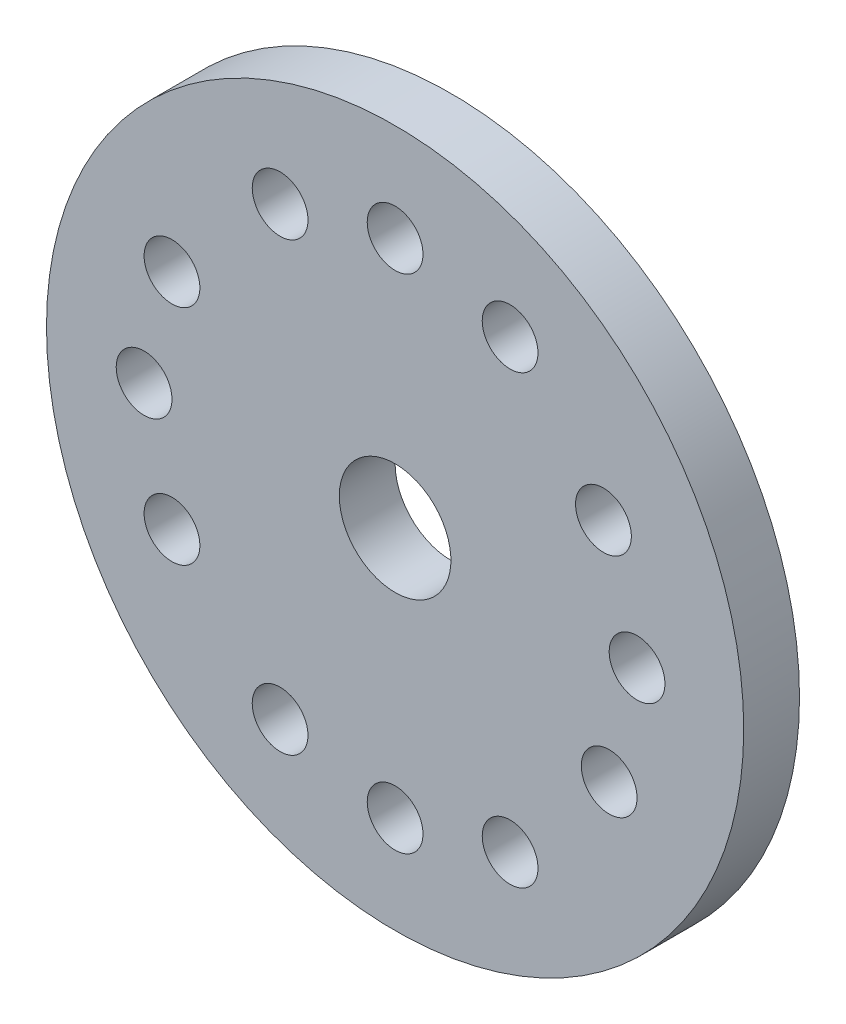
ISO-10303-21;
HEADER;
FILE_DESCRIPTION(('STEP AP214'),'2;1');
FILE_NAME('part.step','',(''),(''),'','','');
FILE_SCHEMA(('AUTOMOTIVE_DESIGN { 1 0 10303 214 1 1 1 1 }'));
ENDSEC;
DATA;
#1=APPLICATION_CONTEXT('core data for automotive mechanical design processes');
#2=APPLICATION_PROTOCOL_DEFINITION('international standard','automotive_design',2000,#1);
#3=PRODUCT_CONTEXT('',#1,'mechanical');
#4=PRODUCT('Part','Part','',(#3));
#5=PRODUCT_RELATED_PRODUCT_CATEGORY('part','',(#4));
#6=PRODUCT_DEFINITION_FORMATION('','',#4);
#7=PRODUCT_DEFINITION_CONTEXT('part definition',#1,'design');
#8=PRODUCT_DEFINITION('design','',#6,#7);
#9=PRODUCT_DEFINITION_SHAPE('','',#8);
#10=(LENGTH_UNIT() NAMED_UNIT(*) SI_UNIT(.MILLI.,.METRE.));
#11=(NAMED_UNIT(*) PLANE_ANGLE_UNIT() SI_UNIT($,.RADIAN.));
#12=(NAMED_UNIT(*) SI_UNIT($,.STERADIAN.) SOLID_ANGLE_UNIT());
#13=UNCERTAINTY_MEASURE_WITH_UNIT(LENGTH_MEASURE(1.E-05),#10,'distance_accuracy_value','');
#14=(GEOMETRIC_REPRESENTATION_CONTEXT(3) GLOBAL_UNCERTAINTY_ASSIGNED_CONTEXT((#13)) GLOBAL_UNIT_ASSIGNED_CONTEXT((#10,
#11,#12)) REPRESENTATION_CONTEXT('',''));
#15=CARTESIAN_POINT('',(0.,0.,0.));
#16=DIRECTION('',(0.,0.,1.));
#17=DIRECTION('',(1.,0.,0.));
#18=AXIS2_PLACEMENT_3D('',#15,#16,#17);
#19=CARTESIAN_POINT('',(0.,0.,0.));
#20=DIRECTION('',(0.,0.,-1.));
#21=DIRECTION('',(-1.,0.,0.));
#22=AXIS2_PLACEMENT_3D('',#19,#20,#21);
#23=PLANE('',#22);
#24=CARTESIAN_POINT('',(0.,0.,0.));
#25=DIRECTION('',(0.,0.,-1.));
#26=DIRECTION('',(-1.,0.,0.));
#27=AXIS2_PLACEMENT_3D('',#24,#25,#26);
#28=CIRCLE('',#27,2.);
#29=CARTESIAN_POINT('',(-2.,0.,0.));
#30=VERTEX_POINT('',#29);
#31=EDGE_CURVE('E65',#30,#30,#28,.F.);
#32=ORIENTED_EDGE('',*,*,#31,.T.);
#33=EDGE_LOOP('',(#32));
#34=FACE_BOUND('',#33,.T.);
#35=CARTESIAN_POINT('',(4.12310562561766,-8.,0.));
#36=DIRECTION('',(0.,0.,-1.));
#37=DIRECTION('',(-1.,0.,0.));
#38=AXIS2_PLACEMENT_3D('',#35,#36,#37);
#39=CIRCLE('',#38,1.);
#40=CARTESIAN_POINT('',(3.12310562561766,-8.,0.));
#41=VERTEX_POINT('',#40);
#42=EDGE_CURVE('E68',#41,#41,#39,.F.);
#43=ORIENTED_EDGE('',*,*,#42,.T.);
#44=EDGE_LOOP('',(#43));
#45=FACE_BOUND('',#44,.T.);
#46=CARTESIAN_POINT('',(-4.12310562561766,-8.,0.));
#47=DIRECTION('',(0.,0.,-1.));
#48=DIRECTION('',(-1.,0.,0.));
#49=AXIS2_PLACEMENT_3D('',#46,#47,#48);
#50=CIRCLE('',#49,1.);
#51=CARTESIAN_POINT('',(-5.12310562561766,-8.,0.));
#52=VERTEX_POINT('',#51);
#53=EDGE_CURVE('E71',#52,#52,#50,.F.);
#54=ORIENTED_EDGE('',*,*,#53,.T.);
#55=EDGE_LOOP('',(#54));
#56=FACE_BOUND('',#55,.T.);
#57=CARTESIAN_POINT('',(4.12310562561766,8.,0.));
#58=DIRECTION('',(0.,0.,-1.));
#59=DIRECTION('',(-1.,0.,0.));
#60=AXIS2_PLACEMENT_3D('',#57,#58,#59);
#61=CIRCLE('',#60,1.);
#62=CARTESIAN_POINT('',(3.12310562561766,8.,0.));
#63=VERTEX_POINT('',#62);
#64=EDGE_CURVE('E74',#63,#63,#61,.F.);
#65=ORIENTED_EDGE('',*,*,#64,.T.);
#66=EDGE_LOOP('',(#65));
#67=FACE_BOUND('',#66,.T.);
#68=CARTESIAN_POINT('',(-4.12310562561766,8.,0.));
#69=DIRECTION('',(0.,0.,-1.));
#70=DIRECTION('',(-1.,0.,0.));
#71=AXIS2_PLACEMENT_3D('',#68,#69,#70);
#72=CIRCLE('',#71,1.);
#73=CARTESIAN_POINT('',(-5.12310562561766,8.,0.));
#74=VERTEX_POINT('',#73);
#75=EDGE_CURVE('E77',#74,#74,#72,.F.);
#76=ORIENTED_EDGE('',*,*,#75,.T.);
#77=EDGE_LOOP('',(#76));
#78=FACE_BOUND('',#77,.T.);
#79=CARTESIAN_POINT('',(-8.,3.95881756244972,0.));
#80=DIRECTION('',(0.,0.,-1.));
#81=DIRECTION('',(-1.,0.,0.));
#82=AXIS2_PLACEMENT_3D('',#79,#80,#81);
#83=CIRCLE('',#82,1.);
#84=CARTESIAN_POINT('',(-9.,3.95881756244972,0.));
#85=VERTEX_POINT('',#84);
#86=EDGE_CURVE('E80',#85,#85,#83,.F.);
#87=ORIENTED_EDGE('',*,*,#86,.T.);
#88=EDGE_LOOP('',(#87));
#89=FACE_BOUND('',#88,.T.);
#90=CARTESIAN_POINT('',(-8.,-4.04118243755028,0.));
#91=DIRECTION('',(0.,0.,-1.));
#92=DIRECTION('',(-1.,0.,0.));
#93=AXIS2_PLACEMENT_3D('',#90,#91,#92);
#94=CIRCLE('',#93,1.);
#95=CARTESIAN_POINT('',(-9.,-4.04118243755028,0.));
#96=VERTEX_POINT('',#95);
#97=EDGE_CURVE('E83',#96,#96,#94,.F.);
#98=ORIENTED_EDGE('',*,*,#97,.T.);
#99=EDGE_LOOP('',(#98));
#100=FACE_BOUND('',#99,.T.);
#101=CARTESIAN_POINT('',(7.4699164837539,3.98000520660212,0.));
#102=DIRECTION('',(0.,0.,-1.));
#103=DIRECTION('',(-1.,0.,0.));
#104=AXIS2_PLACEMENT_3D('',#101,#102,#103);
#105=CIRCLE('',#104,1.);
#106=CARTESIAN_POINT('',(6.4699164837539,3.98000520660212,0.));
#107=VERTEX_POINT('',#106);
#108=EDGE_CURVE('E86',#107,#107,#105,.F.);
#109=ORIENTED_EDGE('',*,*,#108,.T.);
#110=EDGE_LOOP('',(#109));
#111=FACE_BOUND('',#110,.T.);
#112=CARTESIAN_POINT('',(7.67467578644874,-4.04118243755028,0.));
#113=DIRECTION('',(0.,0.,-1.));
#114=DIRECTION('',(-1.,0.,0.));
#115=AXIS2_PLACEMENT_3D('',#112,#113,#114);
#116=CIRCLE('',#115,1.);
#117=CARTESIAN_POINT('',(6.67467578644874,-4.04118243755028,0.));
#118=VERTEX_POINT('',#117);
#119=EDGE_CURVE('E89',#118,#118,#116,.F.);
#120=ORIENTED_EDGE('',*,*,#119,.T.);
#121=EDGE_LOOP('',(#120));
#122=FACE_BOUND('',#121,.T.);
#123=CARTESIAN_POINT('',(8.67467578644874,0.,0.));
#124=DIRECTION('',(0.,0.,-1.));
#125=DIRECTION('',(-1.,0.,0.));
#126=AXIS2_PLACEMENT_3D('',#123,#124,#125);
#127=CIRCLE('',#126,1.);
#128=CARTESIAN_POINT('',(7.67467578644874,0.,0.));
#129=VERTEX_POINT('',#128);
#130=EDGE_CURVE('E92',#129,#129,#127,.F.);
#131=ORIENTED_EDGE('',*,*,#130,.T.);
#132=EDGE_LOOP('',(#131));
#133=FACE_BOUND('',#132,.T.);
#134=CARTESIAN_POINT('',(-9.,0.,0.));
#135=DIRECTION('',(0.,0.,-1.));
#136=DIRECTION('',(-1.,0.,0.));
#137=AXIS2_PLACEMENT_3D('',#134,#135,#136);
#138=CIRCLE('',#137,1.);
#139=CARTESIAN_POINT('',(-10.,0.,0.));
#140=VERTEX_POINT('',#139);
#141=EDGE_CURVE('E95',#140,#140,#138,.F.);
#142=ORIENTED_EDGE('',*,*,#141,.T.);
#143=EDGE_LOOP('',(#142));
#144=FACE_BOUND('',#143,.T.);
#145=CARTESIAN_POINT('',(0.,-9.,0.));
#146=DIRECTION('',(0.,0.,-1.));
#147=DIRECTION('',(-1.,0.,0.));
#148=AXIS2_PLACEMENT_3D('',#145,#146,#147);
#149=CIRCLE('',#148,1.);
#150=CARTESIAN_POINT('',(-1.,-9.,0.));
#151=VERTEX_POINT('',#150);
#152=EDGE_CURVE('E98',#151,#151,#149,.F.);
#153=ORIENTED_EDGE('',*,*,#152,.T.);
#154=EDGE_LOOP('',(#153));
#155=FACE_BOUND('',#154,.T.);
#156=CARTESIAN_POINT('',(0.,9.,0.));
#157=DIRECTION('',(0.,0.,-1.));
#158=DIRECTION('',(-1.,0.,0.));
#159=AXIS2_PLACEMENT_3D('',#156,#157,#158);
#160=CIRCLE('',#159,1.);
#161=CARTESIAN_POINT('',(-1.,9.,0.));
#162=VERTEX_POINT('',#161);
#163=EDGE_CURVE('E100',#162,#162,#160,.F.);
#164=ORIENTED_EDGE('',*,*,#163,.T.);
#165=EDGE_LOOP('',(#164));
#166=FACE_BOUND('',#165,.T.);
#167=CARTESIAN_POINT('',(0.,0.,0.));
#168=DIRECTION('',(0.,0.,1.));
#169=DIRECTION('',(1.,0.,0.));
#170=AXIS2_PLACEMENT_3D('',#167,#168,#169);
#171=CIRCLE('',#170,12.5);
#172=CARTESIAN_POINT('',(12.5,0.,0.));
#173=VERTEX_POINT('',#172);
#174=EDGE_CURVE('E18',#173,#173,#171,.T.);
#175=ORIENTED_EDGE('',*,*,#174,.F.);
#176=EDGE_LOOP('',(#175));
#177=FACE_BOUND('',#176,.T.);
#178=ADVANCED_FACE('F15',(#34,#45,#56,#67,#78,#89,#100,#111,#122,#133,#144,#155,#166,#177),#23,.T.);
#179=CARTESIAN_POINT('',(0.,0.,0.));
#180=DIRECTION('',(0.,0.,1.));
#181=DIRECTION('',(1.,0.,0.));
#182=AXIS2_PLACEMENT_3D('',#179,#180,#181);
#183=CYLINDRICAL_SURFACE('',#182,12.5);
#184=ORIENTED_EDGE('',*,*,#174,.T.);
#185=EDGE_LOOP('',(#184));
#186=FACE_BOUND('',#185,.T.);
#187=CARTESIAN_POINT('',(0.,0.,2.));
#188=DIRECTION('',(0.,0.,1.));
#189=DIRECTION('',(1.,0.,0.));
#190=AXIS2_PLACEMENT_3D('',#187,#188,#189);
#191=CIRCLE('',#190,12.5);
#192=CARTESIAN_POINT('',(12.5,0.,2.));
#193=VERTEX_POINT('',#192);
#194=EDGE_CURVE('E62',#193,#193,#191,.F.);
#195=ORIENTED_EDGE('',*,*,#194,.T.);
#196=EDGE_LOOP('',(#195));
#197=FACE_BOUND('',#196,.T.);
#198=ADVANCED_FACE('F107',(#186,#197),#183,.T.);
#199=CARTESIAN_POINT('',(0.,9.,2.));
#200=DIRECTION('',(0.,0.,-1.));
#201=DIRECTION('',(-1.,0.,0.));
#202=AXIS2_PLACEMENT_3D('',#199,#200,#201);
#203=CYLINDRICAL_SURFACE('',#202,1.);
#204=CARTESIAN_POINT('',(0.,9.,2.));
#205=DIRECTION('',(0.,0.,-1.));
#206=DIRECTION('',(-1.,0.,0.));
#207=AXIS2_PLACEMENT_3D('',#204,#205,#206);
#208=CIRCLE('',#207,1.);
#209=CARTESIAN_POINT('',(-1.,9.,2.));
#210=VERTEX_POINT('',#209);
#211=EDGE_CURVE('E59',#210,#210,#208,.F.);
#212=ORIENTED_EDGE('',*,*,#211,.T.);
#213=EDGE_LOOP('',(#212));
#214=FACE_BOUND('',#213,.T.);
#215=ORIENTED_EDGE('',*,*,#163,.F.);
#216=EDGE_LOOP('',(#215));
#217=FACE_BOUND('',#216,.T.);
#218=ADVANCED_FACE('F116',(#214,#217),#203,.F.);
#219=CARTESIAN_POINT('',(0.,-9.,2.));
#220=DIRECTION('',(0.,0.,-1.));
#221=DIRECTION('',(-1.,0.,0.));
#222=AXIS2_PLACEMENT_3D('',#219,#220,#221);
#223=CYLINDRICAL_SURFACE('',#222,1.);
#224=CARTESIAN_POINT('',(0.,-9.,2.));
#225=DIRECTION('',(0.,0.,-1.));
#226=DIRECTION('',(-1.,0.,0.));
#227=AXIS2_PLACEMENT_3D('',#224,#225,#226);
#228=CIRCLE('',#227,1.);
#229=CARTESIAN_POINT('',(-1.,-9.,2.));
#230=VERTEX_POINT('',#229);
#231=EDGE_CURVE('E56',#230,#230,#228,.F.);
#232=ORIENTED_EDGE('',*,*,#231,.T.);
#233=EDGE_LOOP('',(#232));
#234=FACE_BOUND('',#233,.T.);
#235=ORIENTED_EDGE('',*,*,#152,.F.);
#236=EDGE_LOOP('',(#235));
#237=FACE_BOUND('',#236,.T.);
#238=ADVANCED_FACE('F168',(#234,#237),#223,.F.);
#239=CARTESIAN_POINT('',(-9.,0.,2.));
#240=DIRECTION('',(0.,0.,-1.));
#241=DIRECTION('',(-1.,0.,0.));
#242=AXIS2_PLACEMENT_3D('',#239,#240,#241);
#243=CYLINDRICAL_SURFACE('',#242,1.);
#244=CARTESIAN_POINT('',(-9.,0.,2.));
#245=DIRECTION('',(0.,0.,-1.));
#246=DIRECTION('',(-1.,0.,0.));
#247=AXIS2_PLACEMENT_3D('',#244,#245,#246);
#248=CIRCLE('',#247,1.);
#249=CARTESIAN_POINT('',(-10.,0.,2.));
#250=VERTEX_POINT('',#249);
#251=EDGE_CURVE('E53',#250,#250,#248,.F.);
#252=ORIENTED_EDGE('',*,*,#251,.T.);
#253=EDGE_LOOP('',(#252));
#254=FACE_BOUND('',#253,.T.);
#255=ORIENTED_EDGE('',*,*,#141,.F.);
#256=EDGE_LOOP('',(#255));
#257=FACE_BOUND('',#256,.T.);
#258=ADVANCED_FACE('F164',(#254,#257),#243,.F.);
#259=CARTESIAN_POINT('',(8.67467578644874,0.,2.));
#260=DIRECTION('',(0.,0.,-1.));
#261=DIRECTION('',(-1.,0.,0.));
#262=AXIS2_PLACEMENT_3D('',#259,#260,#261);
#263=CYLINDRICAL_SURFACE('',#262,1.);
#264=CARTESIAN_POINT('',(8.67467578644874,0.,2.));
#265=DIRECTION('',(0.,0.,-1.));
#266=DIRECTION('',(-1.,0.,0.));
#267=AXIS2_PLACEMENT_3D('',#264,#265,#266);
#268=CIRCLE('',#267,1.);
#269=CARTESIAN_POINT('',(7.67467578644874,0.,2.));
#270=VERTEX_POINT('',#269);
#271=EDGE_CURVE('E50',#270,#270,#268,.F.);
#272=ORIENTED_EDGE('',*,*,#271,.T.);
#273=EDGE_LOOP('',(#272));
#274=FACE_BOUND('',#273,.T.);
#275=ORIENTED_EDGE('',*,*,#130,.F.);
#276=EDGE_LOOP('',(#275));
#277=FACE_BOUND('',#276,.T.);
#278=ADVANCED_FACE('F160',(#274,#277),#263,.F.);
#279=CARTESIAN_POINT('',(7.67467578644874,-4.04118243755028,2.));
#280=DIRECTION('',(0.,0.,-1.));
#281=DIRECTION('',(-1.,0.,0.));
#282=AXIS2_PLACEMENT_3D('',#279,#280,#281);
#283=CYLINDRICAL_SURFACE('',#282,1.);
#284=CARTESIAN_POINT('',(7.67467578644874,-4.04118243755028,2.));
#285=DIRECTION('',(0.,0.,-1.));
#286=DIRECTION('',(-1.,0.,0.));
#287=AXIS2_PLACEMENT_3D('',#284,#285,#286);
#288=CIRCLE('',#287,1.);
#289=CARTESIAN_POINT('',(6.67467578644874,-4.04118243755028,2.));
#290=VERTEX_POINT('',#289);
#291=EDGE_CURVE('E47',#290,#290,#288,.F.);
#292=ORIENTED_EDGE('',*,*,#291,.T.);
#293=EDGE_LOOP('',(#292));
#294=FACE_BOUND('',#293,.T.);
#295=ORIENTED_EDGE('',*,*,#119,.F.);
#296=EDGE_LOOP('',(#295));
#297=FACE_BOUND('',#296,.T.);
#298=ADVANCED_FACE('F156',(#294,#297),#283,.F.);
#299=CARTESIAN_POINT('',(7.4699164837539,3.98000520660212,2.));
#300=DIRECTION('',(0.,0.,-1.));
#301=DIRECTION('',(-1.,0.,0.));
#302=AXIS2_PLACEMENT_3D('',#299,#300,#301);
#303=CYLINDRICAL_SURFACE('',#302,1.);
#304=CARTESIAN_POINT('',(7.4699164837539,3.98000520660212,2.));
#305=DIRECTION('',(0.,0.,-1.));
#306=DIRECTION('',(-1.,0.,0.));
#307=AXIS2_PLACEMENT_3D('',#304,#305,#306);
#308=CIRCLE('',#307,1.);
#309=CARTESIAN_POINT('',(6.4699164837539,3.98000520660212,2.));
#310=VERTEX_POINT('',#309);
#311=EDGE_CURVE('E44',#310,#310,#308,.F.);
#312=ORIENTED_EDGE('',*,*,#311,.T.);
#313=EDGE_LOOP('',(#312));
#314=FACE_BOUND('',#313,.T.);
#315=ORIENTED_EDGE('',*,*,#108,.F.);
#316=EDGE_LOOP('',(#315));
#317=FACE_BOUND('',#316,.T.);
#318=ADVANCED_FACE('F152',(#314,#317),#303,.F.);
#319=CARTESIAN_POINT('',(-8.,-4.04118243755028,2.));
#320=DIRECTION('',(0.,0.,-1.));
#321=DIRECTION('',(-1.,0.,0.));
#322=AXIS2_PLACEMENT_3D('',#319,#320,#321);
#323=CYLINDRICAL_SURFACE('',#322,1.);
#324=CARTESIAN_POINT('',(-8.,-4.04118243755028,2.));
#325=DIRECTION('',(0.,0.,-1.));
#326=DIRECTION('',(-1.,0.,0.));
#327=AXIS2_PLACEMENT_3D('',#324,#325,#326);
#328=CIRCLE('',#327,1.);
#329=CARTESIAN_POINT('',(-9.,-4.04118243755028,2.));
#330=VERTEX_POINT('',#329);
#331=EDGE_CURVE('E41',#330,#330,#328,.F.);
#332=ORIENTED_EDGE('',*,*,#331,.T.);
#333=EDGE_LOOP('',(#332));
#334=FACE_BOUND('',#333,.T.);
#335=ORIENTED_EDGE('',*,*,#97,.F.);
#336=EDGE_LOOP('',(#335));
#337=FACE_BOUND('',#336,.T.);
#338=ADVANCED_FACE('F148',(#334,#337),#323,.F.);
#339=CARTESIAN_POINT('',(-8.,3.95881756244972,2.));
#340=DIRECTION('',(0.,0.,-1.));
#341=DIRECTION('',(-1.,0.,0.));
#342=AXIS2_PLACEMENT_3D('',#339,#340,#341);
#343=CYLINDRICAL_SURFACE('',#342,1.);
#344=CARTESIAN_POINT('',(-8.,3.95881756244972,2.));
#345=DIRECTION('',(0.,0.,-1.));
#346=DIRECTION('',(-1.,0.,0.));
#347=AXIS2_PLACEMENT_3D('',#344,#345,#346);
#348=CIRCLE('',#347,1.);
#349=CARTESIAN_POINT('',(-9.,3.95881756244972,2.));
#350=VERTEX_POINT('',#349);
#351=EDGE_CURVE('E38',#350,#350,#348,.F.);
#352=ORIENTED_EDGE('',*,*,#351,.T.);
#353=EDGE_LOOP('',(#352));
#354=FACE_BOUND('',#353,.T.);
#355=ORIENTED_EDGE('',*,*,#86,.F.);
#356=EDGE_LOOP('',(#355));
#357=FACE_BOUND('',#356,.T.);
#358=ADVANCED_FACE('F144',(#354,#357),#343,.F.);
#359=CARTESIAN_POINT('',(-4.12310562561766,8.,2.));
#360=DIRECTION('',(0.,0.,-1.));
#361=DIRECTION('',(-1.,0.,0.));
#362=AXIS2_PLACEMENT_3D('',#359,#360,#361);
#363=CYLINDRICAL_SURFACE('',#362,1.);
#364=CARTESIAN_POINT('',(-4.12310562561766,8.,2.));
#365=DIRECTION('',(0.,0.,-1.));
#366=DIRECTION('',(-1.,0.,0.));
#367=AXIS2_PLACEMENT_3D('',#364,#365,#366);
#368=CIRCLE('',#367,1.);
#369=CARTESIAN_POINT('',(-5.12310562561766,8.,2.));
#370=VERTEX_POINT('',#369);
#371=EDGE_CURVE('E35',#370,#370,#368,.F.);
#372=ORIENTED_EDGE('',*,*,#371,.T.);
#373=EDGE_LOOP('',(#372));
#374=FACE_BOUND('',#373,.T.);
#375=ORIENTED_EDGE('',*,*,#75,.F.);
#376=EDGE_LOOP('',(#375));
#377=FACE_BOUND('',#376,.T.);
#378=ADVANCED_FACE('F140',(#374,#377),#363,.F.);
#379=CARTESIAN_POINT('',(4.12310562561766,8.,2.));
#380=DIRECTION('',(0.,0.,-1.));
#381=DIRECTION('',(-1.,0.,0.));
#382=AXIS2_PLACEMENT_3D('',#379,#380,#381);
#383=CYLINDRICAL_SURFACE('',#382,1.);
#384=CARTESIAN_POINT('',(4.12310562561766,8.,2.));
#385=DIRECTION('',(0.,0.,-1.));
#386=DIRECTION('',(-1.,0.,0.));
#387=AXIS2_PLACEMENT_3D('',#384,#385,#386);
#388=CIRCLE('',#387,1.);
#389=CARTESIAN_POINT('',(3.12310562561766,8.,2.));
#390=VERTEX_POINT('',#389);
#391=EDGE_CURVE('E32',#390,#390,#388,.F.);
#392=ORIENTED_EDGE('',*,*,#391,.T.);
#393=EDGE_LOOP('',(#392));
#394=FACE_BOUND('',#393,.T.);
#395=ORIENTED_EDGE('',*,*,#64,.F.);
#396=EDGE_LOOP('',(#395));
#397=FACE_BOUND('',#396,.T.);
#398=ADVANCED_FACE('F136',(#394,#397),#383,.F.);
#399=CARTESIAN_POINT('',(-4.12310562561766,-8.,2.));
#400=DIRECTION('',(0.,0.,-1.));
#401=DIRECTION('',(-1.,0.,0.));
#402=AXIS2_PLACEMENT_3D('',#399,#400,#401);
#403=CYLINDRICAL_SURFACE('',#402,1.);
#404=CARTESIAN_POINT('',(-4.12310562561766,-8.,2.));
#405=DIRECTION('',(0.,0.,-1.));
#406=DIRECTION('',(-1.,0.,0.));
#407=AXIS2_PLACEMENT_3D('',#404,#405,#406);
#408=CIRCLE('',#407,1.);
#409=CARTESIAN_POINT('',(-5.12310562561766,-8.,2.));
#410=VERTEX_POINT('',#409);
#411=EDGE_CURVE('E27',#410,#410,#408,.F.);
#412=ORIENTED_EDGE('',*,*,#411,.T.);
#413=EDGE_LOOP('',(#412));
#414=FACE_BOUND('',#413,.T.);
#415=ORIENTED_EDGE('',*,*,#53,.F.);
#416=EDGE_LOOP('',(#415));
#417=FACE_BOUND('',#416,.T.);
#418=ADVANCED_FACE('F132',(#414,#417),#403,.F.);
#419=CARTESIAN_POINT('',(4.12310562561766,-8.,2.));
#420=DIRECTION('',(0.,0.,-1.));
#421=DIRECTION('',(-1.,0.,0.));
#422=AXIS2_PLACEMENT_3D('',#419,#420,#421);
#423=CYLINDRICAL_SURFACE('',#422,1.);
#424=CARTESIAN_POINT('',(4.12310562561766,-8.,2.));
#425=DIRECTION('',(0.,0.,-1.));
#426=DIRECTION('',(-1.,0.,0.));
#427=AXIS2_PLACEMENT_3D('',#424,#425,#426);
#428=CIRCLE('',#427,1.);
#429=CARTESIAN_POINT('',(3.12310562561766,-8.,2.));
#430=VERTEX_POINT('',#429);
#431=EDGE_CURVE('E22',#430,#430,#428,.F.);
#432=ORIENTED_EDGE('',*,*,#431,.T.);
#433=EDGE_LOOP('',(#432));
#434=FACE_BOUND('',#433,.T.);
#435=ORIENTED_EDGE('',*,*,#42,.F.);
#436=EDGE_LOOP('',(#435));
#437=FACE_BOUND('',#436,.T.);
#438=ADVANCED_FACE('F126',(#434,#437),#423,.F.);
#439=CARTESIAN_POINT('',(0.,0.,2.));
#440=DIRECTION('',(0.,0.,-1.));
#441=DIRECTION('',(-1.,0.,0.));
#442=AXIS2_PLACEMENT_3D('',#439,#440,#441);
#443=CYLINDRICAL_SURFACE('',#442,2.);
#444=CARTESIAN_POINT('',(0.,0.,2.));
#445=DIRECTION('',(0.,0.,-1.));
#446=DIRECTION('',(-1.,0.,0.));
#447=AXIS2_PLACEMENT_3D('',#444,#445,#446);
#448=CIRCLE('',#447,2.);
#449=CARTESIAN_POINT('',(-2.,0.,2.));
#450=VERTEX_POINT('',#449);
#451=EDGE_CURVE('E10',#450,#450,#448,.F.);
#452=ORIENTED_EDGE('',*,*,#451,.T.);
#453=EDGE_LOOP('',(#452));
#454=FACE_BOUND('',#453,.T.);
#455=ORIENTED_EDGE('',*,*,#31,.F.);
#456=EDGE_LOOP('',(#455));
#457=FACE_BOUND('',#456,.T.);
#458=ADVANCED_FACE('F120',(#454,#457),#443,.F.);
#459=CARTESIAN_POINT('',(0.,0.,2.));
#460=DIRECTION('',(0.,0.,-1.));
#461=DIRECTION('',(-1.,0.,0.));
#462=AXIS2_PLACEMENT_3D('',#459,#460,#461);
#463=PLANE('',#462);
#464=ORIENTED_EDGE('',*,*,#451,.F.);
#465=EDGE_LOOP('',(#464));
#466=FACE_BOUND('',#465,.T.);
#467=ORIENTED_EDGE('',*,*,#431,.F.);
#468=EDGE_LOOP('',(#467));
#469=FACE_BOUND('',#468,.T.);
#470=ORIENTED_EDGE('',*,*,#411,.F.);
#471=EDGE_LOOP('',(#470));
#472=FACE_BOUND('',#471,.T.);
#473=ORIENTED_EDGE('',*,*,#391,.F.);
#474=EDGE_LOOP('',(#473));
#475=FACE_BOUND('',#474,.T.);
#476=ORIENTED_EDGE('',*,*,#371,.F.);
#477=EDGE_LOOP('',(#476));
#478=FACE_BOUND('',#477,.T.);
#479=ORIENTED_EDGE('',*,*,#351,.F.);
#480=EDGE_LOOP('',(#479));
#481=FACE_BOUND('',#480,.T.);
#482=ORIENTED_EDGE('',*,*,#331,.F.);
#483=EDGE_LOOP('',(#482));
#484=FACE_BOUND('',#483,.T.);
#485=ORIENTED_EDGE('',*,*,#311,.F.);
#486=EDGE_LOOP('',(#485));
#487=FACE_BOUND('',#486,.T.);
#488=ORIENTED_EDGE('',*,*,#291,.F.);
#489=EDGE_LOOP('',(#488));
#490=FACE_BOUND('',#489,.T.);
#491=ORIENTED_EDGE('',*,*,#271,.F.);
#492=EDGE_LOOP('',(#491));
#493=FACE_BOUND('',#492,.T.);
#494=ORIENTED_EDGE('',*,*,#251,.F.);
#495=EDGE_LOOP('',(#494));
#496=FACE_BOUND('',#495,.T.);
#497=ORIENTED_EDGE('',*,*,#231,.F.);
#498=EDGE_LOOP('',(#497));
#499=FACE_BOUND('',#498,.T.);
#500=ORIENTED_EDGE('',*,*,#211,.F.);
#501=EDGE_LOOP('',(#500));
#502=FACE_BOUND('',#501,.T.);
#503=ORIENTED_EDGE('',*,*,#194,.F.);
#504=EDGE_LOOP('',(#503));
#505=FACE_BOUND('',#504,.T.);
#506=ADVANCED_FACE('F118',(#466,#469,#472,#475,#478,#481,#484,#487,#490,#493,#496,#499,#502,
#505),#463,.F.);
#507=CLOSED_SHELL('',(#178,#198,#218,#238,#258,#278,#298,#318,#338,#358,#378,#398,#418,#438,
#458,#506));
#508=MANIFOLD_SOLID_BREP('B1',#507);
#509=ADVANCED_BREP_SHAPE_REPRESENTATION('',(#18,#508),#14);
#510=SHAPE_DEFINITION_REPRESENTATION(#9,#509);
ENDSEC;
END-ISO-10303-21;
